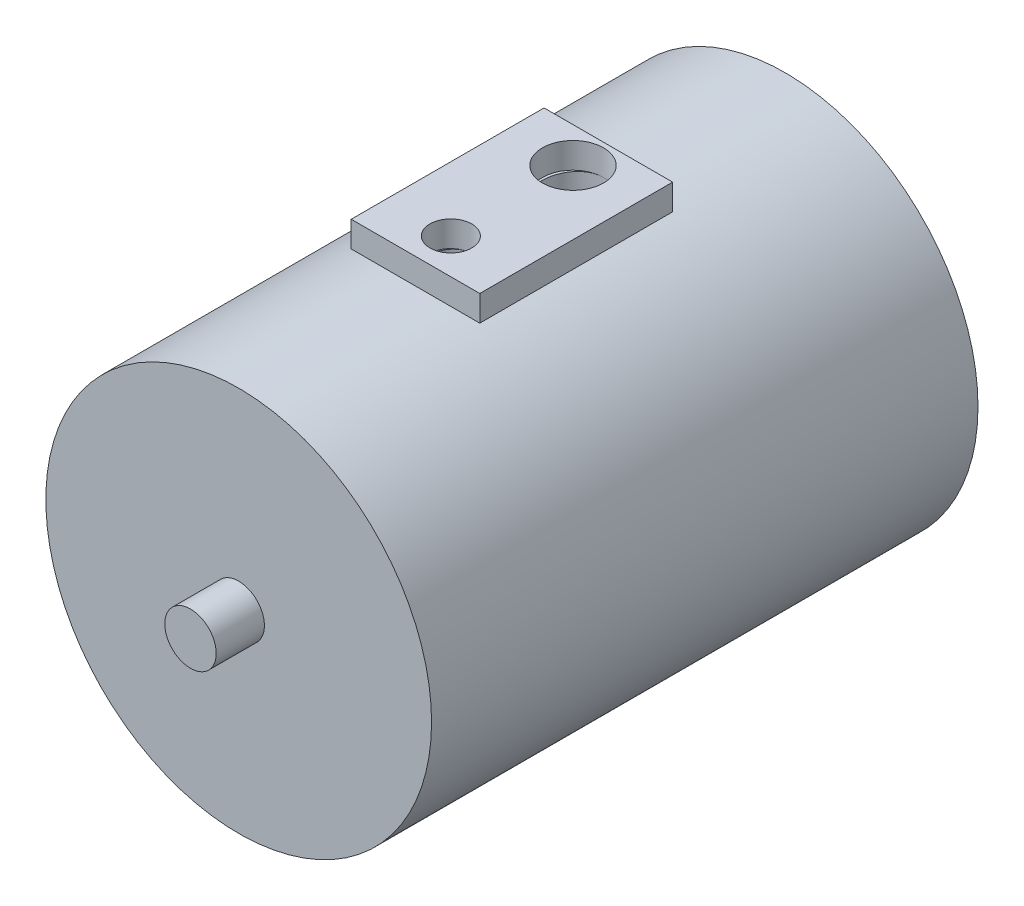
ISO-10303-21;
HEADER;
FILE_DESCRIPTION(('STEP AP214'),'2;1');
FILE_NAME('part.step','',(''),(''),'','','');
FILE_SCHEMA(('AUTOMOTIVE_DESIGN { 1 0 10303 214 1 1 1 1 }'));
ENDSEC;
DATA;
#1=APPLICATION_CONTEXT('core data for automotive mechanical design processes');
#2=APPLICATION_PROTOCOL_DEFINITION('international standard','automotive_design',2000,#1);
#3=PRODUCT_CONTEXT('',#1,'mechanical');
#4=PRODUCT('Part','Part','',(#3));
#5=PRODUCT_RELATED_PRODUCT_CATEGORY('part','',(#4));
#6=PRODUCT_DEFINITION_FORMATION('','',#4);
#7=PRODUCT_DEFINITION_CONTEXT('part definition',#1,'design');
#8=PRODUCT_DEFINITION('design','',#6,#7);
#9=PRODUCT_DEFINITION_SHAPE('','',#8);
#10=(LENGTH_UNIT() NAMED_UNIT(*) SI_UNIT(.MILLI.,.METRE.));
#11=(NAMED_UNIT(*) PLANE_ANGLE_UNIT() SI_UNIT($,.RADIAN.));
#12=(NAMED_UNIT(*) SI_UNIT($,.STERADIAN.) SOLID_ANGLE_UNIT());
#13=UNCERTAINTY_MEASURE_WITH_UNIT(LENGTH_MEASURE(1.E-05),#10,'distance_accuracy_value','');
#14=(GEOMETRIC_REPRESENTATION_CONTEXT(3) GLOBAL_UNCERTAINTY_ASSIGNED_CONTEXT((#13)) GLOBAL_UNIT_ASSIGNED_CONTEXT((#10,
#11,#12)) REPRESENTATION_CONTEXT('',''));
#15=CARTESIAN_POINT('',(0.,0.,0.));
#16=DIRECTION('',(0.,0.,1.));
#17=DIRECTION('',(1.,0.,0.));
#18=AXIS2_PLACEMENT_3D('',#15,#16,#17);
#19=CARTESIAN_POINT('',(20.,68.,30.));
#20=DIRECTION('',(-1.,0.,0.));
#21=DIRECTION('',(0.,-1.,0.));
#22=AXIS2_PLACEMENT_3D('',#19,#20,#21);
#23=PLANE('',#22);
#24=DIRECTION('',(0.,1.,0.));
#25=VECTOR('',#24,1.);
#26=CARTESIAN_POINT('',(20.,68.,-30.));
#27=LINE('',#26,#25);
#28=CARTESIAN_POINT('',(20.,60.,-30.));
#29=VERTEX_POINT('',#28);
#30=CARTESIAN_POINT('',(20.,68.,-30.));
#31=VERTEX_POINT('',#30);
#32=EDGE_CURVE('E123',#29,#31,#27,.T.);
#33=ORIENTED_EDGE('',*,*,#32,.T.);
#34=DIRECTION('',(0.,0.,-1.));
#35=VECTOR('',#34,1.);
#36=CARTESIAN_POINT('',(20.,68.,30.));
#37=LINE('',#36,#35);
#38=CARTESIAN_POINT('',(20.,68.,30.));
#39=VERTEX_POINT('',#38);
#40=EDGE_CURVE('E12',#39,#31,#37,.T.);
#41=ORIENTED_EDGE('',*,*,#40,.F.);
#42=DIRECTION('',(0.,1.,0.));
#43=VECTOR('',#42,1.);
#44=CARTESIAN_POINT('',(20.,68.,30.));
#45=LINE('',#44,#43);
#46=CARTESIAN_POINT('',(20.,60.,30.));
#47=VERTEX_POINT('',#46);
#48=EDGE_CURVE('E110',#47,#39,#45,.T.);
#49=ORIENTED_EDGE('',*,*,#48,.F.);
#50=DIRECTION('',(0.,0.,-1.));
#51=VECTOR('',#50,1.);
#52=CARTESIAN_POINT('',(20.,60.,30.));
#53=LINE('',#52,#51);
#54=EDGE_CURVE('E122',#47,#29,#53,.T.);
#55=ORIENTED_EDGE('',*,*,#54,.T.);
#56=EDGE_LOOP('',(#33,#41,#49,#55));
#57=FACE_BOUND('',#56,.T.);
#58=ADVANCED_FACE('F52',(#57),#23,.F.);
#59=CARTESIAN_POINT('',(-20.,68.,30.));
#60=DIRECTION('',(0.,-1.,0.));
#61=DIRECTION('',(0.,0.,-1.));
#62=AXIS2_PLACEMENT_3D('',#59,#60,#61);
#63=PLANE('',#62);
#64=CARTESIAN_POINT('',(0.,68.,-19.));
#65=DIRECTION('',(0.,1.,0.));
#66=DIRECTION('',(0.,0.,1.));
#67=AXIS2_PLACEMENT_3D('',#64,#65,#66);
#68=CIRCLE('',#67,9.5);
#69=CARTESIAN_POINT('',(0.,68.,-9.5));
#70=VERTEX_POINT('',#69);
#71=EDGE_CURVE('E142',#70,#70,#68,.T.);
#72=ORIENTED_EDGE('',*,*,#71,.F.);
#73=EDGE_LOOP('',(#72));
#74=FACE_BOUND('',#73,.T.);
#75=CARTESIAN_POINT('',(0.,68.,19.));
#76=DIRECTION('',(0.,1.,0.));
#77=DIRECTION('',(0.,0.,1.));
#78=AXIS2_PLACEMENT_3D('',#75,#76,#77);
#79=CIRCLE('',#78,6.5);
#80=CARTESIAN_POINT('',(0.,68.,25.5));
#81=VERTEX_POINT('',#80);
#82=EDGE_CURVE('E149',#81,#81,#79,.T.);
#83=ORIENTED_EDGE('',*,*,#82,.F.);
#84=EDGE_LOOP('',(#83));
#85=FACE_BOUND('',#84,.T.);
#86=DIRECTION('',(-1.,0.,0.));
#87=VECTOR('',#86,1.);
#88=CARTESIAN_POINT('',(-20.,68.,-30.));
#89=LINE('',#88,#87);
#90=CARTESIAN_POINT('',(-20.,68.,-30.));
#91=VERTEX_POINT('',#90);
#92=EDGE_CURVE('E115',#31,#91,#89,.T.);
#93=ORIENTED_EDGE('',*,*,#92,.T.);
#94=DIRECTION('',(0.,0.,-1.));
#95=VECTOR('',#94,1.);
#96=CARTESIAN_POINT('',(-20.,68.,30.));
#97=LINE('',#96,#95);
#98=CARTESIAN_POINT('',(-20.,68.,30.));
#99=VERTEX_POINT('',#98);
#100=EDGE_CURVE('E64',#99,#91,#97,.T.);
#101=ORIENTED_EDGE('',*,*,#100,.F.);
#102=DIRECTION('',(-1.,0.,0.));
#103=VECTOR('',#102,1.);
#104=CARTESIAN_POINT('',(-20.,68.,30.));
#105=LINE('',#104,#103);
#106=EDGE_CURVE('E105',#39,#99,#105,.T.);
#107=ORIENTED_EDGE('',*,*,#106,.F.);
#108=ORIENTED_EDGE('',*,*,#40,.T.);
#109=EDGE_LOOP('',(#93,#101,#107,#108));
#110=FACE_BOUND('',#109,.T.);
#111=ADVANCED_FACE('F111',(#74,#85,#110),#63,.F.);
#112=CARTESIAN_POINT('',(-20.,68.,30.));
#113=DIRECTION('',(1.,0.,0.));
#114=DIRECTION('',(0.,1.,0.));
#115=AXIS2_PLACEMENT_3D('',#112,#113,#114);
#116=PLANE('',#115);
#117=DIRECTION('',(0.,-1.,0.));
#118=VECTOR('',#117,1.);
#119=CARTESIAN_POINT('',(-20.,68.,-30.));
#120=LINE('',#119,#118);
#121=CARTESIAN_POINT('',(-20.,60.,-30.));
#122=VERTEX_POINT('',#121);
#123=EDGE_CURVE('E90',#91,#122,#120,.T.);
#124=ORIENTED_EDGE('',*,*,#123,.T.);
#125=DIRECTION('',(0.,0.,-1.));
#126=VECTOR('',#125,1.);
#127=CARTESIAN_POINT('',(-20.,60.,30.));
#128=LINE('',#127,#126);
#129=CARTESIAN_POINT('',(-20.,60.,30.));
#130=VERTEX_POINT('',#129);
#131=EDGE_CURVE('E112',#130,#122,#128,.T.);
#132=ORIENTED_EDGE('',*,*,#131,.F.);
#133=DIRECTION('',(0.,-1.,0.));
#134=VECTOR('',#133,1.);
#135=CARTESIAN_POINT('',(-20.,68.,30.));
#136=LINE('',#135,#134);
#137=EDGE_CURVE('E102',#99,#130,#136,.T.);
#138=ORIENTED_EDGE('',*,*,#137,.F.);
#139=ORIENTED_EDGE('',*,*,#100,.T.);
#140=EDGE_LOOP('',(#124,#132,#138,#139));
#141=FACE_BOUND('',#140,.T.);
#142=ADVANCED_FACE('F116',(#141),#116,.F.);
#143=CARTESIAN_POINT('',(-20.,60.,30.));
#144=DIRECTION('',(0.,1.,0.));
#145=DIRECTION('',(0.,0.,1.));
#146=AXIS2_PLACEMENT_3D('',#143,#144,#145);
#147=PLANE('',#146);
#148=CARTESIAN_POINT('',(0.,60.,-19.));
#149=DIRECTION('',(0.,1.,0.));
#150=DIRECTION('',(0.,0.,1.));
#151=AXIS2_PLACEMENT_3D('',#148,#149,#150);
#152=CIRCLE('',#151,9.5);
#153=CARTESIAN_POINT('',(0.,60.,-9.5));
#154=VERTEX_POINT('',#153);
#155=EDGE_CURVE('E57',#154,#154,#152,.T.);
#156=ORIENTED_EDGE('',*,*,#155,.T.);
#157=EDGE_LOOP('',(#156));
#158=FACE_BOUND('',#157,.T.);
#159=CARTESIAN_POINT('',(0.,60.,19.));
#160=DIRECTION('',(0.,1.,0.));
#161=DIRECTION('',(0.,0.,1.));
#162=AXIS2_PLACEMENT_3D('',#159,#160,#161);
#163=CIRCLE('',#162,6.5);
#164=CARTESIAN_POINT('',(0.,60.,25.5));
#165=VERTEX_POINT('',#164);
#166=EDGE_CURVE('E138',#165,#165,#163,.T.);
#167=ORIENTED_EDGE('',*,*,#166,.T.);
#168=EDGE_LOOP('',(#167));
#169=FACE_BOUND('',#168,.T.);
#170=DIRECTION('',(1.,0.,0.));
#171=VECTOR('',#170,1.);
#172=CARTESIAN_POINT('',(-20.,60.,-30.));
#173=LINE('',#172,#171);
#174=EDGE_CURVE('E91',#122,#29,#173,.T.);
#175=ORIENTED_EDGE('',*,*,#174,.T.);
#176=ORIENTED_EDGE('',*,*,#54,.F.);
#177=DIRECTION('',(1.,0.,0.));
#178=VECTOR('',#177,1.);
#179=CARTESIAN_POINT('',(-20.,60.,30.));
#180=LINE('',#179,#178);
#181=EDGE_CURVE('E75',#130,#47,#180,.T.);
#182=ORIENTED_EDGE('',*,*,#181,.F.);
#183=ORIENTED_EDGE('',*,*,#131,.T.);
#184=EDGE_LOOP('',(#175,#176,#182,#183));
#185=FACE_BOUND('',#184,.T.);
#186=ADVANCED_FACE('F164',(#158,#169,#185),#147,.F.);
#187=CARTESIAN_POINT('',(0.,0.,30.));
#188=DIRECTION('',(0.,0.,1.));
#189=DIRECTION('',(1.,0.,0.));
#190=AXIS2_PLACEMENT_3D('',#187,#188,#189);
#191=PLANE('',#190);
#192=ORIENTED_EDGE('',*,*,#48,.T.);
#193=ORIENTED_EDGE('',*,*,#106,.T.);
#194=ORIENTED_EDGE('',*,*,#137,.T.);
#195=ORIENTED_EDGE('',*,*,#181,.T.);
#196=EDGE_LOOP('',(#192,#193,#194,#195));
#197=FACE_BOUND('',#196,.T.);
#198=ADVANCED_FACE('F101',(#197),#191,.T.);
#199=CARTESIAN_POINT('',(0.,0.,-30.));
#200=DIRECTION('',(0.,0.,1.));
#201=DIRECTION('',(1.,0.,0.));
#202=AXIS2_PLACEMENT_3D('',#199,#200,#201);
#203=PLANE('',#202);
#204=ORIENTED_EDGE('',*,*,#32,.F.);
#205=ORIENTED_EDGE('',*,*,#174,.F.);
#206=ORIENTED_EDGE('',*,*,#123,.F.);
#207=ORIENTED_EDGE('',*,*,#92,.F.);
#208=EDGE_LOOP('',(#204,#205,#206,#207));
#209=FACE_BOUND('',#208,.T.);
#210=ADVANCED_FACE('F175',(#209),#203,.F.);
#211=CARTESIAN_POINT('',(0.,43.,19.));
#212=DIRECTION('',(0.,1.,0.));
#213=DIRECTION('',(0.,0.,1.));
#214=AXIS2_PLACEMENT_3D('',#211,#212,#213);
#215=CYLINDRICAL_SURFACE('',#214,6.5);
#216=ORIENTED_EDGE('',*,*,#82,.T.);
#217=EDGE_LOOP('',(#216));
#218=FACE_BOUND('',#217,.T.);
#219=ORIENTED_EDGE('',*,*,#166,.F.);
#220=EDGE_LOOP('',(#219));
#221=FACE_BOUND('',#220,.T.);
#222=ADVANCED_FACE('F160',(#218,#221),#215,.F.);
#223=CARTESIAN_POINT('',(0.,43.,-19.));
#224=DIRECTION('',(0.,1.,0.));
#225=DIRECTION('',(0.,0.,1.));
#226=AXIS2_PLACEMENT_3D('',#223,#224,#225);
#227=CYLINDRICAL_SURFACE('',#226,9.5);
#228=ORIENTED_EDGE('',*,*,#71,.T.);
#229=EDGE_LOOP('',(#228));
#230=FACE_BOUND('',#229,.T.);
#231=ORIENTED_EDGE('',*,*,#155,.F.);
#232=EDGE_LOOP('',(#231));
#233=FACE_BOUND('',#232,.T.);
#234=ADVANCED_FACE('F179',(#230,#233),#227,.F.);
#235=CLOSED_SHELL('',(#58,#111,#142,#186,#198,#210,#222,#234));
#236=MANIFOLD_SOLID_BREP('B2',#235);
#237=CARTESIAN_POINT('',(0.,0.,85.));
#238=DIRECTION('',(0.,0.,-1.));
#239=DIRECTION('',(-1.,0.,0.));
#240=AXIS2_PLACEMENT_3D('',#237,#238,#239);
#241=CYLINDRICAL_SURFACE('',#240,60.);
#242=CARTESIAN_POINT('',(0.,60.,-9.5));
#243=CARTESIAN_POINT('',(-0.265124042040666,60.0000015957338,-9.49999616003085));
#244=CARTESIAN_POINT('',(-0.530195168028865,59.9982394272567,-9.51110210308025));
#245=CARTESIAN_POINT('',(-1.05851705475029,59.9912434179105,-9.55543562867729));
#246=CARTESIAN_POINT('',(-1.32176743230257,59.9860088674623,-9.58866773269687));
#247=CARTESIAN_POINT('',(-1.84469221106528,59.9722069140623,-9.67704462680988));
#248=CARTESIAN_POINT('',(-2.1043634539615,59.9636367410772,-9.73220763001137));
#249=CARTESIAN_POINT('',(-2.61807379485254,59.9434046969972,-9.86402681967473));
#250=CARTESIAN_POINT('',(-2.87211279947014,59.9317427746856,-9.9406833621922));
#251=CARTESIAN_POINT('',(-3.37256063633518,59.9056639633893,-10.1148452406669));
#252=CARTESIAN_POINT('',(-3.6189754907864,59.8912493168221,-10.2123336142869));
#253=CARTESIAN_POINT('',(-4.10268226431326,59.8600596593791,-10.4274820113141));
#254=CARTESIAN_POINT('',(-4.33997407756483,59.8432846211341,-10.5451422686217));
#255=CARTESIAN_POINT('',(-4.80372725791672,59.8078446083801,-10.7997466271467));
#256=CARTESIAN_POINT('',(-5.03019206480954,59.7891802400745,-10.9366845484799));
#257=CARTESIAN_POINT('',(-5.47090968278327,59.7504653261608,-11.2289584359617));
#258=CARTESIAN_POINT('',(-5.68515813472168,59.7304142913287,-11.3843009092714));
#259=CARTESIAN_POINT('',(-6.1014325587491,59.689334001406,-11.7134749749972));
#260=CARTESIAN_POINT('',(-6.30335706993875,59.668298637317,-11.8874341246706));
#261=CARTESIAN_POINT('',(-6.69195674323945,59.6259670208285,-12.2517643504445));
#262=CARTESIAN_POINT('',(-6.87862493005987,59.6046706541574,-12.442142852727));
#263=CARTESIAN_POINT('',(-7.23533389327367,59.5624228177932,-12.8379449489341));
#264=CARTESIAN_POINT('',(-7.40537364363828,59.5414713694489,-13.0433694698809));
#265=CARTESIAN_POINT('',(-7.7275550564835,59.5005147907129,-13.4677459466852));
#266=CARTESIAN_POINT('',(-7.87970479174967,59.4805092359468,-13.6866917325791));
#267=CARTESIAN_POINT('',(-8.16597294997158,59.4418865802492,-14.1380329240889));
#268=CARTESIAN_POINT('',(-8.29997849603773,59.4232784655965,-14.3705007152288));
#269=CARTESIAN_POINT('',(-8.54785863274525,59.3881283272045,-14.845970148217));
#270=CARTESIAN_POINT('',(-8.66174086344945,59.371585520049,-15.0889677484732));
#271=CARTESIAN_POINT('',(-8.8686076039813,59.3410375788183,-15.5838989367809));
#272=CARTESIAN_POINT('',(-8.96158907311266,59.3270328140413,-15.835833818886));
#273=CARTESIAN_POINT('',(-9.12592838365157,59.3019759159193,-16.3468031830467));
#274=CARTESIAN_POINT('',(-9.19728642332831,59.2909237555015,-16.6058375999815));
#275=CARTESIAN_POINT('',(-9.317327614938,59.2721778706238,-17.1269534762433));
#276=CARTESIAN_POINT('',(-9.36619456769278,59.2644569564271,-17.3889916239717));
#277=CARTESIAN_POINT('',(-9.44174738874412,59.252467233181,-17.916324839263));
#278=CARTESIAN_POINT('',(-9.46843336768391,59.2481984069117,-18.1816198905732));
#279=CARTESIAN_POINT('',(-9.49941606011105,59.2432387861799,-18.7135325703122));
#280=CARTESIAN_POINT('',(-9.50371403526724,59.2425477900898,-18.9801501233642));
#281=CARTESIAN_POINT('',(-9.4898904786288,59.2447637144434,-19.5127875701796));
#282=CARTESIAN_POINT('',(-9.47176906008619,59.2476706167121,-19.7788074669553));
#283=CARTESIAN_POINT('',(-9.4135205224869,59.256953080197,-20.3058612040174));
#284=CARTESIAN_POINT('',(-9.3735993215842,59.2632961791112,-20.5669184060046));
#285=CARTESIAN_POINT('',(-9.27219466398347,59.2792462546061,-21.0847068003622));
#286=CARTESIAN_POINT('',(-9.21071136141126,59.2888532078567,-21.3414380236411));
#287=CARTESIAN_POINT('',(-9.06665462208972,59.3110535930087,-21.848734681279));
#288=CARTESIAN_POINT('',(-8.98408457367007,59.3236465450807,-22.0993010991464));
#289=CARTESIAN_POINT('',(-8.79842321262466,59.3514663338811,-22.5926654907754));
#290=CARTESIAN_POINT('',(-8.6953242925208,59.3666941467471,-22.8354605458356));
#291=CARTESIAN_POINT('',(-8.46889957610184,59.3994181039578,-23.3125097650683));
#292=CARTESIAN_POINT('',(-8.34549154419043,59.4169234073221,-23.5467242650301));
#293=CARTESIAN_POINT('',(-8.0796311625289,59.4536589252316,-24.0039481756595));
#294=CARTESIAN_POINT('',(-7.93717822509312,59.4728891929995,-24.2269572402588));
#295=CARTESIAN_POINT('',(-7.63422168414546,59.5125364063412,-24.6602602585705));
#296=CARTESIAN_POINT('',(-7.47371722964817,59.5329534078382,-24.8705536121192));
#297=CARTESIAN_POINT('',(-7.13576940285304,59.5744053083063,-25.2769934791576));
#298=CARTESIAN_POINT('',(-6.95832590592356,59.5954402118231,-25.4731398885405));
#299=CARTESIAN_POINT('',(-6.58563359032671,59.6377815230625,-25.852068172652));
#300=CARTESIAN_POINT('',(-6.39020775461808,59.6590883350912,-26.0346759448985));
#301=CARTESIAN_POINT('',(-5.98462896824395,59.7011371007277,-26.3827931839921));
#302=CARTESIAN_POINT('',(-5.77447630978525,59.7218790655317,-26.5483029899327));
#303=CARTESIAN_POINT('',(-5.34084606107602,59.7622186575292,-26.8610970176835));
#304=CARTESIAN_POINT('',(-5.11736567643939,59.7818160430251,-27.0083773973333));
#305=CARTESIAN_POINT('',(-4.65875732708377,59.8193019243113,-27.2835659806216));
#306=CARTESIAN_POINT('',(-4.42363378315635,59.8371910612653,-27.4114814631997));
#307=CARTESIAN_POINT('',(-3.94308583190213,59.8707786104089,-27.6471821110739));
#308=CARTESIAN_POINT('',(-3.69765226403105,59.8864750183987,-27.7549488900825));
#309=CARTESIAN_POINT('',(-3.19842006241166,59.915211891547,-27.9494061241074));
#310=CARTESIAN_POINT('',(-2.94462141391509,59.9282523520226,-28.0360965419623));
#311=CARTESIAN_POINT('',(-2.43049190199869,59.9513045243917,-28.1877383135696));
#312=CARTESIAN_POINT('',(-2.17016144165526,59.9613164226817,-28.2526910052218));
#313=CARTESIAN_POINT('',(-1.64483831057431,59.9780256502624,-28.3603629325532));
#314=CARTESIAN_POINT('',(-1.37984568414189,59.9847230110339,-28.4030823793995));
#315=CARTESIAN_POINT('',(-0.849965949491697,59.9945583173637,-28.4656204955216));
#316=CARTESIAN_POINT('',(-0.585107673457824,59.9977333492125,-28.4856778146543));
#317=CARTESIAN_POINT('',(-0.0546237943288705,60.0005614038762,-28.503549227254));
#318=CARTESIAN_POINT('',(0.211001803333124,60.0002144515679,-28.5013634778308));
#319=CARTESIAN_POINT('',(0.741100550010575,59.9960084102797,-28.4747662937745));
#320=CARTESIAN_POINT('',(1.00557373652322,59.9921494364444,-28.4503555878062));
#321=CARTESIAN_POINT('',(1.53147819859651,59.9810282637338,-28.3794975045178));
#322=CARTESIAN_POINT('',(1.79290947723241,59.9737660682991,-28.3330501494777));
#323=CARTESIAN_POINT('',(2.3094088776837,59.95609254146,-28.218795751057));
#324=CARTESIAN_POINT('',(2.56450448963458,59.9456991246933,-28.151110128911));
#325=CARTESIAN_POINT('',(3.06815292970187,59.9220328568939,-27.9947756418605));
#326=CARTESIAN_POINT('',(3.31670333523706,59.9087589560476,-27.9061191328979));
#327=CARTESIAN_POINT('',(3.80540613793697,59.8797027449988,-27.7085212737035));
#328=CARTESIAN_POINT('',(4.04555985285697,59.8639208305729,-27.5995831235476));
#329=CARTESIAN_POINT('',(4.51587573688181,59.8302804518886,-27.3621921562664));
#330=CARTESIAN_POINT('',(4.74603758174054,59.8124219203108,-27.2337387064579));
#331=CARTESIAN_POINT('',(5.19660694120562,59.7749679804481,-26.9571174892728));
#332=CARTESIAN_POINT('',(5.41692131483611,59.7553597795247,-26.8087997345988));
#333=CARTESIAN_POINT('',(5.84430230932396,59.7150752346993,-26.4942993791974));
#334=CARTESIAN_POINT('',(6.05136887113159,59.694398886037,-26.3281166988491));
#335=CARTESIAN_POINT('',(6.45085837829518,59.6525504420294,-25.9790253569223));
#336=CARTESIAN_POINT('',(6.6432803116955,59.6313783125573,-25.7961155414046));
#337=CARTESIAN_POINT('',(7.01214829022295,59.5891286051081,-25.4148371001692));
#338=CARTESIAN_POINT('',(7.18859462201177,59.5680510254408,-25.2164687519538));
#339=CARTESIAN_POINT('',(7.52590252641078,59.5263803156005,-24.8036635274272));
#340=CARTESIAN_POINT('',(7.68659976878278,59.5057937063436,-24.5890916751449));
#341=CARTESIAN_POINT('',(7.98928551613769,59.4659114194379,-24.1471376696309));
#342=CARTESIAN_POINT('',(8.13128088543323,59.4466152694276,-23.9197602605266));
#343=CARTESIAN_POINT('',(8.39563201092504,59.4098576313634,-23.4536676139544));
#344=CARTESIAN_POINT('',(8.51798446698347,59.3923964517662,-23.2149504800506));
#345=CARTESIAN_POINT('',(8.74212074199585,59.3598193935657,-22.7278933541805));
#346=CARTESIAN_POINT('',(8.84390469496417,59.3447034996818,-22.4795534249242));
#347=CARTESIAN_POINT('',(9.02578973526516,59.3173124154447,-21.9759885384997));
#348=CARTESIAN_POINT('',(9.10597290127468,59.3050264983159,-21.7207938153186));
#349=CARTESIAN_POINT('',(9.24456355560128,59.2835809298292,-21.2044281842334));
#350=CARTESIAN_POINT('',(9.30297107743856,59.2744212736588,-20.9432572855293));
#351=CARTESIAN_POINT('',(9.3975565851328,59.2594990409114,-20.4168416924363));
#352=CARTESIAN_POINT('',(9.43373602325826,59.2537362424021,-20.1515972653515));
#353=CARTESIAN_POINT('',(9.48358844440793,59.2457778282792,-19.6189492562244));
#354=CARTESIAN_POINT('',(9.49726161652286,59.2435821826953,-19.3515456923414));
#355=CARTESIAN_POINT('',(9.50196830253887,59.2428274284292,-18.8195434253461));
#356=CARTESIAN_POINT('',(9.49325457652667,59.2442277196115,-18.5549469812738));
#357=CARTESIAN_POINT('',(9.45378722839567,59.2505384384116,-18.0274469935767));
#358=CARTESIAN_POINT('',(9.42303378207233,59.2554488380317,-17.7645434364658));
#359=CARTESIAN_POINT('',(9.33972271017311,59.268637190137,-17.2423029068213));
#360=CARTESIAN_POINT('',(9.28716522577353,59.2769151208181,-16.9829659112063));
#361=CARTESIAN_POINT('',(9.16064373838699,59.2965993941178,-16.4696893226864));
#362=CARTESIAN_POINT('',(9.08667967208798,59.308005745989,-16.2157497457473));
#363=CARTESIAN_POINT('',(8.9179918771472,59.3336050085412,-15.7153292223821));
#364=CARTESIAN_POINT('',(8.82329170008704,59.3477947560181,-15.4688401723805));
#365=CARTESIAN_POINT('',(8.61373822005822,59.3785712608402,-14.9846382730984));
#366=CARTESIAN_POINT('',(8.49887793563716,59.395158848206,-14.7469284987145));
#367=CARTESIAN_POINT('',(8.24986714707752,59.4302573662307,-14.2820326452904));
#368=CARTESIAN_POINT('',(8.11571948295809,59.4487680136127,-14.0548450233894));
#369=CARTESIAN_POINT('',(7.82906174695202,59.4871977475562,-13.6124906769082));
#370=CARTESIAN_POINT('',(7.67655147654505,59.5071168493437,-13.3973240823255));
#371=CARTESIAN_POINT('',(7.35246502354526,59.5480328332879,-12.9781900694511));
#372=CARTESIAN_POINT('',(7.18069942676094,59.5690390850261,-12.7743699990523));
#373=CARTESIAN_POINT('',(6.82072950877834,59.6113283744541,-12.3819549906804));
#374=CARTESIAN_POINT('',(6.63253035960337,59.6326113232789,-12.1933552981986));
#375=CARTESIAN_POINT('',(6.24086389224151,59.6748726014334,-11.8325357696707));
#376=CARTESIAN_POINT('',(6.03739055291464,59.6958508067014,-11.6603224544967));
#377=CARTESIAN_POINT('',(5.61664077405051,59.7369066505009,-11.3335603318431));
#378=CARTESIAN_POINT('',(5.39936448779486,59.7569842990289,-11.1790113282548));
#379=CARTESIAN_POINT('',(4.95111010463802,59.7957976740169,-10.8877630594052));
#380=CARTESIAN_POINT('',(4.72005530440294,59.8145242937099,-10.7511805905593));
#381=CARTESIAN_POINT('',(4.24710392059605,59.8499652403097,-10.4979968793852));
#382=CARTESIAN_POINT('',(4.00520751633578,59.8666796004808,-10.3813953067426));
#383=CARTESIAN_POINT('',(3.51248973316484,59.8976065141799,-10.1691282499326));
#384=CARTESIAN_POINT('',(3.26167651097779,59.9118212868601,-10.0734441765098));
#385=CARTESIAN_POINT('',(2.75280322249459,59.9373590754464,-9.903625053897));
#386=CARTESIAN_POINT('',(2.49474475940831,59.9486827255823,-9.82948527801027));
#387=CARTESIAN_POINT('',(1.86882364323167,59.9719994281073,-9.67806450309329));
#388=CARTESIAN_POINT('',(1.49829051547843,59.9824517711373,-9.61136719195814));
#389=CARTESIAN_POINT('',(0.751802757371482,59.9964508754085,-9.52233798728589));
#390=CARTESIAN_POINT('',(0.375848206540471,59.9999977378374,-9.50000544366142));
#391=CARTESIAN_POINT('',(0.,60.,-9.5));
#392=B_SPLINE_CURVE_WITH_KNOTS('',3,(#242,#243,#244,#245,#246,#247,#248,#249,#250,#251,#252,
#253,#254,#255,#256,#257,#258,#259,#260,#261,#262,#263,#264,#265,#266,#267,#268,#269,#270,#271,
#272,#273,#274,#275,#276,#277,#278,#279,#280,#281,#282,#283,#284,#285,#286,#287,#288,#289,#290,
#291,#292,#293,#294,#295,#296,#297,#298,#299,#300,#301,#302,#303,#304,#305,#306,#307,#308,#309,
#310,#311,#312,#313,#314,#315,#316,#317,#318,#319,#320,#321,#322,#323,#324,#325,#326,#327,#328,
#329,#330,#331,#332,#333,#334,#335,#336,#337,#338,#339,#340,#341,#342,#343,#344,#345,#346,#347,
#348,#349,#350,#351,#352,#353,#354,#355,#356,#357,#358,#359,#360,#361,#362,#363,#364,#365,#366,
#367,#368,#369,#370,#371,#372,#373,#374,#375,#376,#377,#378,#379,#380,#381,#382,#383,#384,#385,
#386,#387,#388,#389,#390,#391),.UNSPECIFIED.,.T.,.F.,(4,2,2,2,2,2,2,2,2,2,2,2,2,2,2,2,2,2,2,2,2,
2,2,2,2,2,2,2,2,2,2,2,2,2,2,2,2,2,2,2,2,2,2,2,2,2,2,2,2,2,2,2,2,2,2,2,2,2,2,2,2,2,2,2,2,2,2,2,2,
2,2,2,2,2,4),(0.,0.795042803221871,1.59024812300059,2.38611522668362,3.18199551524443,
3.97723021028656,4.77247412698974,5.5674636886337,6.36273517239254,7.16385456246242,
7.96533820404044,8.76687126861105,9.56804124568518,10.3739864245746,11.1796249559842,
11.9853806180015,12.7911288916744,13.5901701399012,14.3892074023226,15.1881996347653,
15.9871878310989,16.7787562435141,17.5703189979168,18.3617546397778,19.1534841152381,
19.948502116055,20.7435446551166,21.5386246898304,22.3337105749201,23.1376931419579,
23.9416597610417,24.7457955422039,25.549628307714,26.3541910519804,27.158755214827,
27.963269849751,28.7677768434045,29.5637304002242,30.3596783349736,31.1556001748029,
31.9515212099185,32.7429723415624,33.5347124093269,34.3263276605442,35.1179685812898,
35.9159647695408,36.7139645144685,37.5120193518511,38.3100598663242,39.1156965439778,
39.9210366927505,40.7265120026607,41.5319820643169,42.3343468907394,43.1367104820414,
43.9390216454629,44.7413260680785,45.5346119507931,46.3278915060902,47.121165925158,
47.9144426904361,48.7068231015492,49.4994784576384,50.2920172164858,51.084564544333,
51.8857363160673,52.686656842897,53.4878947703974,54.2891238017126,55.0953280396403,
55.9015189485048,56.7069904612552,57.5122851244697,58.6393794012572,59.7664571623453),.UNSPECIFIED.);
#393=CARTESIAN_POINT('',(0.,60.,-9.5));
#394=VERTEX_POINT('',#393);
#395=EDGE_CURVE('E250',#394,#394,#392,.T.);
#396=ORIENTED_EDGE('',*,*,#395,.T.);
#397=EDGE_LOOP('',(#396));
#398=FACE_BOUND('',#397,.T.);
#399=CARTESIAN_POINT('',(0.,60.,25.5));
#400=CARTESIAN_POINT('',(-0.182046077812597,60.0000005512898,25.5000018804154));
#401=CARTESIAN_POINT('',(-0.364063799830583,59.9991698200927,25.492349290981));
#402=CARTESIAN_POINT('',(-0.726858253605583,59.9958712818835,25.4617963415901));
#403=CARTESIAN_POINT('',(-0.907634682613746,59.9934030888915,25.4388923866021));
#404=CARTESIAN_POINT('',(-1.2667362182005,59.98689575744,25.3779758429165));
#405=CARTESIAN_POINT('',(-1.44505929739117,59.9828553920652,25.3399514537995));
#406=CARTESIAN_POINT('',(-1.79791144728133,59.9733163572605,25.2490572741603));
#407=CARTESIAN_POINT('',(-1.97243910386672,59.9678171540321,25.1961820492002));
#408=CARTESIAN_POINT('',(-2.31622361897269,59.9555224095038,25.0760374762692));
#409=CARTESIAN_POINT('',(-2.48548556480857,59.9487281676629,25.0087825489158));
#410=CARTESIAN_POINT('',(-2.81779259981937,59.9340280598928,24.8603050618929));
#411=CARTESIAN_POINT('',(-2.9808353726132,59.9261217848192,24.7790773588297));
#412=CARTESIAN_POINT('',(-3.29940674032258,59.909426192446,24.6033019624374));
#413=CARTESIAN_POINT('',(-3.45493952720256,59.9006373764066,24.5087618180904));
#414=CARTESIAN_POINT('',(-3.75756277751289,59.8824157259088,24.3069587084923));
#415=CARTESIAN_POINT('',(-3.90465008989235,59.8729826539124,24.1996910397226));
#416=CARTESIAN_POINT('',(-4.18977706176412,59.8537071414178,23.9728332025656));
#417=CARTESIAN_POINT('',(-4.3277846271297,59.8438634307839,23.8532028029166));
#418=CARTESIAN_POINT('',(-4.59329269082614,59.8240703672681,23.602714894045));
#419=CARTESIAN_POINT('',(-4.72078928585486,59.8141209766759,23.4718532505352));
#420=CARTESIAN_POINT('',(-4.96428549104252,59.7944043327681,23.1999012760571));
#421=CARTESIAN_POINT('',(-5.08028877173558,59.7846370221171,23.0588142357838));
#422=CARTESIAN_POINT('',(-5.30006852131307,59.765554037856,22.7673075671));
#423=CARTESIAN_POINT('',(-5.40384046300016,59.756238532219,22.6168845143934));
#424=CARTESIAN_POINT('',(-5.5985801708904,59.7383083737484,22.3074739640906));
#425=CARTESIAN_POINT('',(-5.68952005226927,59.7296952638851,22.1484688222854));
#426=CARTESIAN_POINT('',(-5.85770897616119,59.7134355631729,21.8232563701481));
#427=CARTESIAN_POINT('',(-5.93495293208623,59.7057893317183,21.65704641239));
#428=CARTESIAN_POINT('',(-6.07512092594117,59.6916902316358,21.3187073942804));
#429=CARTESIAN_POINT('',(-6.13805057086766,59.6852368959302,21.1465806820733));
#430=CARTESIAN_POINT('',(-6.24918638487637,59.6737022773523,20.7975745691778));
#431=CARTESIAN_POINT('',(-6.29738713717432,59.6686214993392,20.6206934459352));
#432=CARTESIAN_POINT('',(-6.41892530566864,59.6557155851441,20.0863418309788));
#433=CARTESIAN_POINT('',(-6.46990914346148,59.6501529258485,19.723442582625));
#434=CARTESIAN_POINT('',(-6.51025676033161,59.6457618968454,18.9943966042663));
#435=CARTESIAN_POINT('',(-6.49962242315941,59.6469333212681,18.6282499738799));
#436=CARTESIAN_POINT('',(-6.41731231041319,59.6558445061413,17.9045076553246));
#437=CARTESIAN_POINT('',(-6.34589708215126,59.6635562300242,17.5468821565992));
#438=CARTESIAN_POINT('',(-6.1444366073691,59.6846384128903,16.8487365753346));
#439=CARTESIAN_POINT('',(-6.01439044556105,59.6980089602132,16.5082167599245));
#440=CARTESIAN_POINT('',(-5.6990800586457,59.7289335960474,15.8531123597374));
#441=CARTESIAN_POINT('',(-5.513700943101,59.7464963737375,15.5385834934079));
#442=CARTESIAN_POINT('',(-5.09306777720589,59.7838196863126,14.945003977014));
#443=CARTESIAN_POINT('',(-4.85781201265219,59.8035802967235,14.6659545468647));
#444=CARTESIAN_POINT('',(-4.34265185853992,59.8431976151621,14.1497399249936));
#445=CARTESIAN_POINT('',(-4.06252252456918,59.8630542908099,13.9127991568081));
#446=CARTESIAN_POINT('',(-3.46634601516735,59.9005300684161,13.4892699832846));
#447=CARTESIAN_POINT('',(-3.15029878808271,59.9181491671565,13.3026816503597));
#448=CARTESIAN_POINT('',(-2.49109701829062,59.9491718728363,12.985159993494));
#449=CARTESIAN_POINT('',(-2.14793654839204,59.9625745548223,12.8542388790329));
#450=CARTESIAN_POINT('',(-1.44432630605254,59.9836452589293,12.6519367430859));
#451=CARTESIAN_POINT('',(-1.08387714119616,59.9913134824221,12.5805536308475));
#452=CARTESIAN_POINT('',(-0.357863916235592,60.000025314694,12.4996404074641));
#453=CARTESIAN_POINT('',(0.00766526641223186,60.0011020736243,12.4898007730742));
#454=CARTESIAN_POINT('',(0.735167410039654,59.9965987360795,12.5314396708317));
#455=CARTESIAN_POINT('',(1.09714042747527,59.9910187454566,12.5829172279449));
#456=CARTESIAN_POINT('',(1.8063556272206,59.9738499079039,12.7454723214186));
#457=CARTESIAN_POINT('',(2.15363160175497,59.9622757576806,12.8564041087502));
#458=CARTESIAN_POINT('',(2.82464730501885,59.9344161865084,13.1345684898811));
#459=CARTESIAN_POINT('',(3.14838641995543,59.9181306427512,13.3018025512881));
#460=CARTESIAN_POINT('',(3.76453287246443,59.8825853374959,13.6885857893406));
#461=CARTESIAN_POINT('',(4.05681249020183,59.8633141736548,13.90833735785));
#462=CARTESIAN_POINT('',(4.6004481919379,59.8239944165303,14.3936299817737));
#463=CARTESIAN_POINT('',(4.85180306605938,59.8039458002844,14.6591723904462));
#464=CARTESIAN_POINT('',(5.30753672384521,59.7652300656048,15.2298586510097));
#465=CARTESIAN_POINT('',(5.51171172831025,59.7465691677329,15.535165701432));
#466=CARTESIAN_POINT('',(5.86588503593509,59.7128393860369,16.175932019838));
#467=CARTESIAN_POINT('',(6.01588418974547,59.6977704458144,16.5113908142861));
#468=CARTESIAN_POINT('',(6.25711699749428,59.6729690242083,17.202183859122));
#469=CARTESIAN_POINT('',(6.34846991882208,59.6632257182519,17.5574761638789));
#470=CARTESIAN_POINT('',(6.47017783213574,59.6501527021254,18.2786685148876));
#471=CARTESIAN_POINT('',(6.50053490603421,59.6468227730539,18.6445681986555));
#472=CARTESIAN_POINT('',(6.49972203309093,59.6469060730592,19.1920235892386));
#473=CARTESIAN_POINT('',(6.49179033139674,59.6477731967516,19.373901266131));
#474=CARTESIAN_POINT('',(6.46071565050926,59.6511479582699,19.7363189070909));
#475=CARTESIAN_POINT('',(6.43757832373031,59.6536549864894,19.9168593430435));
#476=CARTESIAN_POINT('',(6.3762441633128,59.6602417459041,20.2753891119805));
#477=CARTESIAN_POINT('',(6.33804182317833,59.6643220521446,20.4533774874663));
#478=CARTESIAN_POINT('',(6.24687752764803,59.6739358743746,20.8054267321572));
#479=CARTESIAN_POINT('',(6.19392096053187,59.6794688597997,20.9794890101444));
#480=CARTESIAN_POINT('',(6.07361596671718,59.6918322880778,21.3225497786291));
#481=CARTESIAN_POINT('',(6.00626519625701,59.698662942206,21.4915474393555));
#482=CARTESIAN_POINT('',(5.85768890170289,59.7134243570624,21.8232049693753));
#483=CARTESIAN_POINT('',(5.77646843678166,59.7213547164598,21.9858671231613));
#484=CARTESIAN_POINT('',(5.60068255723697,59.7380962929065,22.3038415556014));
#485=CARTESIAN_POINT('',(5.50611237191279,59.7469078245249,22.4591511801196));
#486=CARTESIAN_POINT('',(5.30435363475056,59.7651577786013,22.7612244834361));
#487=CARTESIAN_POINT('',(5.19716965502871,59.7745959733757,22.907991230113));
#488=CARTESIAN_POINT('',(4.97029828608977,59.7938889881157,23.1927863012296));
#489=CARTESIAN_POINT('',(4.8505468877636,59.8037457719865,23.3307635074249));
#490=CARTESIAN_POINT('',(4.59990833703524,59.8235458301046,23.5961002222558));
#491=CARTESIAN_POINT('',(4.46902525604949,59.8334890715458,23.7234635794531));
#492=CARTESIAN_POINT('',(4.1969190364098,59.8531910960013,23.9668103863297));
#493=CARTESIAN_POINT('',(4.055689671235,59.862949763418,24.0827868833707));
#494=CARTESIAN_POINT('',(3.76400389531239,59.8819974892023,24.3024137660953));
#495=CARTESIAN_POINT('',(3.61355091144167,59.891286719669,24.4060686880838));
#496=CARTESIAN_POINT('',(3.30391575560241,59.9091667650016,24.6006862952814));
#497=CARTESIAN_POINT('',(3.14470654678333,59.9177551867979,24.691606193774));
#498=CARTESIAN_POINT('',(2.81919988923522,59.9339524356981,24.8596630016827));
#499=CARTESIAN_POINT('',(2.65290506556904,59.9415616214584,24.9368049614647));
#500=CARTESIAN_POINT('',(2.31448509862105,59.9555819440835,25.0767305292249));
#501=CARTESIAN_POINT('',(2.14236479053373,59.9619940470616,25.1395257250912));
#502=CARTESIAN_POINT('',(1.79345411191902,59.9734441251504,25.2503624731026));
#503=CARTESIAN_POINT('',(1.61666488577777,59.9784824336218,25.2984076048089));
#504=CARTESIAN_POINT('',(1.20249447485908,59.9884111653334,25.3923666243001));
#505=CARTESIAN_POINT('',(0.963809808374483,59.9927394515419,25.4326895054383));
#506=CARTESIAN_POINT('',(0.483400093070993,59.9985334957169,25.4865048773849));
#507=CARTESIAN_POINT('',(0.241675059608831,59.9999992681358,25.4999975036567));
#508=CARTESIAN_POINT('',(0.,60.,25.5));
#509=B_SPLINE_CURVE_WITH_KNOTS('',3,(#399,#400,#401,#402,#403,#404,#405,#406,#407,#408,#409,
#410,#411,#412,#413,#414,#415,#416,#417,#418,#419,#420,#421,#422,#423,#424,#425,#426,#427,#428,
#429,#430,#431,#432,#433,#434,#435,#436,#437,#438,#439,#440,#441,#442,#443,#444,#445,#446,#447,
#448,#449,#450,#451,#452,#453,#454,#455,#456,#457,#458,#459,#460,#461,#462,#463,#464,#465,#466,
#467,#468,#469,#470,#471,#472,#473,#474,#475,#476,#477,#478,#479,#480,#481,#482,#483,#484,#485,
#486,#487,#488,#489,#490,#491,#492,#493,#494,#495,#496,#497,#498,#499,#500,#501,#502,#503,#504,
#505,#506,#507,#508),.UNSPECIFIED.,.T.,.F.,(4,2,2,2,2,2,2,2,2,2,2,2,2,2,2,2,2,2,2,2,2,2,2,2,2,2,
2,2,2,2,2,2,2,2,2,2,2,2,2,2,2,2,2,2,2,2,2,2,2,2,2,2,2,2,4),(0.,0.545926847924145,
1.0919824265768,1.63846500164858,2.18514781485701,2.73128493987757,3.27762353042976,
3.8236535513859,4.36988599259358,4.91795559562622,5.46622781879469,6.01432437609624,
6.56262316805906,7.11209567762365,7.66177183260465,8.21123230412131,8.76089460592876,
9.85470161880184,10.9484751926996,12.0375836051624,13.1267090202913,14.2181117581255,
15.3095520123042,16.4066453325962,17.503740230639,18.6010756303186,19.6983724940528,
20.790146208521,21.8819025624003,22.9709946914408,24.0601152115867,25.1535026583682,
26.2469224236036,27.3449801103806,28.4430205550838,29.5388208083466,30.6345836590775,
31.1802105665938,31.7256347618789,32.2712585032221,32.8166832420509,33.3621968583823,
33.9075119140771,34.453022341063,34.9983356426504,35.546575194577,36.094615082994,
36.6429875417075,37.191157482478,37.7411271021026,38.2908947122734,38.840216692565,
39.3894052572478,40.114153470676,40.8388980249088),.UNSPECIFIED.);
#510=CARTESIAN_POINT('',(0.,60.,25.5));
#511=VERTEX_POINT('',#510);
#512=EDGE_CURVE('E275',#511,#511,#509,.T.);
#513=ORIENTED_EDGE('',*,*,#512,.T.);
#514=EDGE_LOOP('',(#513));
#515=FACE_BOUND('',#514,.T.);
#516=CARTESIAN_POINT('',(0.,0.,85.));
#517=DIRECTION('',(0.,0.,1.));
#518=DIRECTION('',(1.,0.,0.));
#519=AXIS2_PLACEMENT_3D('',#516,#517,#518);
#520=CIRCLE('',#519,60.);
#521=CARTESIAN_POINT('',(60.,0.,85.));
#522=VERTEX_POINT('',#521);
#523=EDGE_CURVE('E55',#522,#522,#520,.T.);
#524=ORIENTED_EDGE('',*,*,#523,.F.);
#525=EDGE_LOOP('',(#524));
#526=FACE_BOUND('',#525,.T.);
#527=CARTESIAN_POINT('',(0.,0.,-85.));
#528=DIRECTION('',(0.,0.,1.));
#529=DIRECTION('',(1.,0.,0.));
#530=AXIS2_PLACEMENT_3D('',#527,#528,#529);
#531=CIRCLE('',#530,60.);
#532=CARTESIAN_POINT('',(60.,0.,-85.));
#533=VERTEX_POINT('',#532);
#534=EDGE_CURVE('E257',#533,#533,#531,.T.);
#535=ORIENTED_EDGE('',*,*,#534,.T.);
#536=EDGE_LOOP('',(#535));
#537=FACE_BOUND('',#536,.T.);
#538=ADVANCED_FACE('F243',(#398,#515,#526,#537),#241,.T.);
#539=CARTESIAN_POINT('',(0.,0.,85.));
#540=DIRECTION('',(0.,0.,1.));
#541=DIRECTION('',(1.,0.,0.));
#542=AXIS2_PLACEMENT_3D('',#539,#540,#541);
#543=PLANE('',#542);
#544=CARTESIAN_POINT('',(0.,0.,85.));
#545=DIRECTION('',(0.,0.,1.));
#546=DIRECTION('',(1.,0.,0.));
#547=AXIS2_PLACEMENT_3D('',#544,#545,#546);
#548=CIRCLE('',#547,8.);
#549=CARTESIAN_POINT('',(8.,0.,85.));
#550=VERTEX_POINT('',#549);
#551=EDGE_CURVE('E265',#550,#550,#548,.F.);
#552=ORIENTED_EDGE('',*,*,#551,.T.);
#553=EDGE_LOOP('',(#552));
#554=FACE_BOUND('',#553,.T.);
#555=ORIENTED_EDGE('',*,*,#523,.T.);
#556=EDGE_LOOP('',(#555));
#557=FACE_BOUND('',#556,.T.);
#558=ADVANCED_FACE('F297',(#554,#557),#543,.T.);
#559=CARTESIAN_POINT('',(0.,0.,-85.));
#560=DIRECTION('',(0.,0.,1.));
#561=DIRECTION('',(1.,0.,0.));
#562=AXIS2_PLACEMENT_3D('',#559,#560,#561);
#563=PLANE('',#562);
#564=ORIENTED_EDGE('',*,*,#534,.F.);
#565=EDGE_LOOP('',(#564));
#566=FACE_BOUND('',#565,.T.);
#567=ADVANCED_FACE('F296',(#566),#563,.F.);
#568=CARTESIAN_POINT('',(0.,0.,100.));
#569=DIRECTION('',(0.,0.,-1.));
#570=DIRECTION('',(-1.,0.,0.));
#571=AXIS2_PLACEMENT_3D('',#568,#569,#570);
#572=CYLINDRICAL_SURFACE('',#571,8.);
#573=ORIENTED_EDGE('',*,*,#551,.F.);
#574=EDGE_LOOP('',(#573));
#575=FACE_BOUND('',#574,.T.);
#576=CARTESIAN_POINT('',(0.,0.,100.));
#577=DIRECTION('',(0.,0.,1.));
#578=DIRECTION('',(1.,0.,0.));
#579=AXIS2_PLACEMENT_3D('',#576,#577,#578);
#580=CIRCLE('',#579,8.);
#581=CARTESIAN_POINT('',(8.,0.,100.));
#582=VERTEX_POINT('',#581);
#583=EDGE_CURVE('E270',#582,#582,#580,.T.);
#584=ORIENTED_EDGE('',*,*,#583,.F.);
#585=EDGE_LOOP('',(#584));
#586=FACE_BOUND('',#585,.T.);
#587=ADVANCED_FACE('F295',(#575,#586),#572,.T.);
#588=CARTESIAN_POINT('',(0.,0.,100.));
#589=DIRECTION('',(0.,0.,1.));
#590=DIRECTION('',(1.,0.,0.));
#591=AXIS2_PLACEMENT_3D('',#588,#589,#590);
#592=PLANE('',#591);
#593=ORIENTED_EDGE('',*,*,#583,.T.);
#594=EDGE_LOOP('',(#593));
#595=FACE_BOUND('',#594,.T.);
#596=ADVANCED_FACE('F285',(#595),#592,.T.);
#597=CARTESIAN_POINT('',(0.,43.,19.));
#598=DIRECTION('',(0.,1.,0.));
#599=DIRECTION('',(0.,0.,1.));
#600=AXIS2_PLACEMENT_3D('',#597,#598,#599);
#601=CYLINDRICAL_SURFACE('',#600,6.5);
#602=CARTESIAN_POINT('',(0.,43.,19.));
#603=DIRECTION('',(0.,1.,0.));
#604=DIRECTION('',(0.,0.,1.));
#605=AXIS2_PLACEMENT_3D('',#602,#603,#604);
#606=CIRCLE('',#605,6.5);
#607=CARTESIAN_POINT('',(0.,43.,25.5));
#608=VERTEX_POINT('',#607);
#609=EDGE_CURVE('E321',#608,#608,#606,.T.);
#610=ORIENTED_EDGE('',*,*,#609,.F.);
#611=EDGE_LOOP('',(#610));
#612=FACE_BOUND('',#611,.T.);
#613=ORIENTED_EDGE('',*,*,#512,.F.);
#614=EDGE_LOOP('',(#613));
#615=FACE_BOUND('',#614,.T.);
#616=ADVANCED_FACE('F276',(#612,#615),#601,.F.);
#617=CARTESIAN_POINT('',(0.,43.,19.));
#618=DIRECTION('',(0.,1.,0.));
#619=DIRECTION('',(0.,0.,1.));
#620=AXIS2_PLACEMENT_3D('',#617,#618,#619);
#621=PLANE('',#620);
#622=ORIENTED_EDGE('',*,*,#609,.T.);
#623=EDGE_LOOP('',(#622));
#624=FACE_BOUND('',#623,.T.);
#625=ADVANCED_FACE('F282',(#624),#621,.T.);
#626=CARTESIAN_POINT('',(0.,43.,-19.));
#627=DIRECTION('',(0.,1.,0.));
#628=DIRECTION('',(0.,0.,1.));
#629=AXIS2_PLACEMENT_3D('',#626,#627,#628);
#630=CYLINDRICAL_SURFACE('',#629,9.5);
#631=CARTESIAN_POINT('',(0.,43.,-19.));
#632=DIRECTION('',(0.,1.,0.));
#633=DIRECTION('',(0.,0.,1.));
#634=AXIS2_PLACEMENT_3D('',#631,#632,#633);
#635=CIRCLE('',#634,9.5);
#636=CARTESIAN_POINT('',(0.,43.,-9.5));
#637=VERTEX_POINT('',#636);
#638=EDGE_CURVE('E279',#637,#637,#635,.T.);
#639=ORIENTED_EDGE('',*,*,#638,.F.);
#640=EDGE_LOOP('',(#639));
#641=FACE_BOUND('',#640,.T.);
#642=ORIENTED_EDGE('',*,*,#395,.F.);
#643=EDGE_LOOP('',(#642));
#644=FACE_BOUND('',#643,.T.);
#645=ADVANCED_FACE('F287',(#641,#644),#630,.F.);
#646=CARTESIAN_POINT('',(0.,43.,-19.));
#647=DIRECTION('',(0.,1.,0.));
#648=DIRECTION('',(0.,0.,1.));
#649=AXIS2_PLACEMENT_3D('',#646,#647,#648);
#650=PLANE('',#649);
#651=ORIENTED_EDGE('',*,*,#638,.T.);
#652=EDGE_LOOP('',(#651));
#653=FACE_BOUND('',#652,.T.);
#654=ADVANCED_FACE('F326',(#653),#650,.T.);
#655=CLOSED_SHELL('',(#538,#558,#567,#587,#596,#616,#625,#645,#654));
#656=MANIFOLD_SOLID_BREP('B6',#655);
#657=ADVANCED_BREP_SHAPE_REPRESENTATION('',(#18,#236,#656),#14);
#658=SHAPE_DEFINITION_REPRESENTATION(#9,#657);
ENDSEC;
END-ISO-10303-21;
